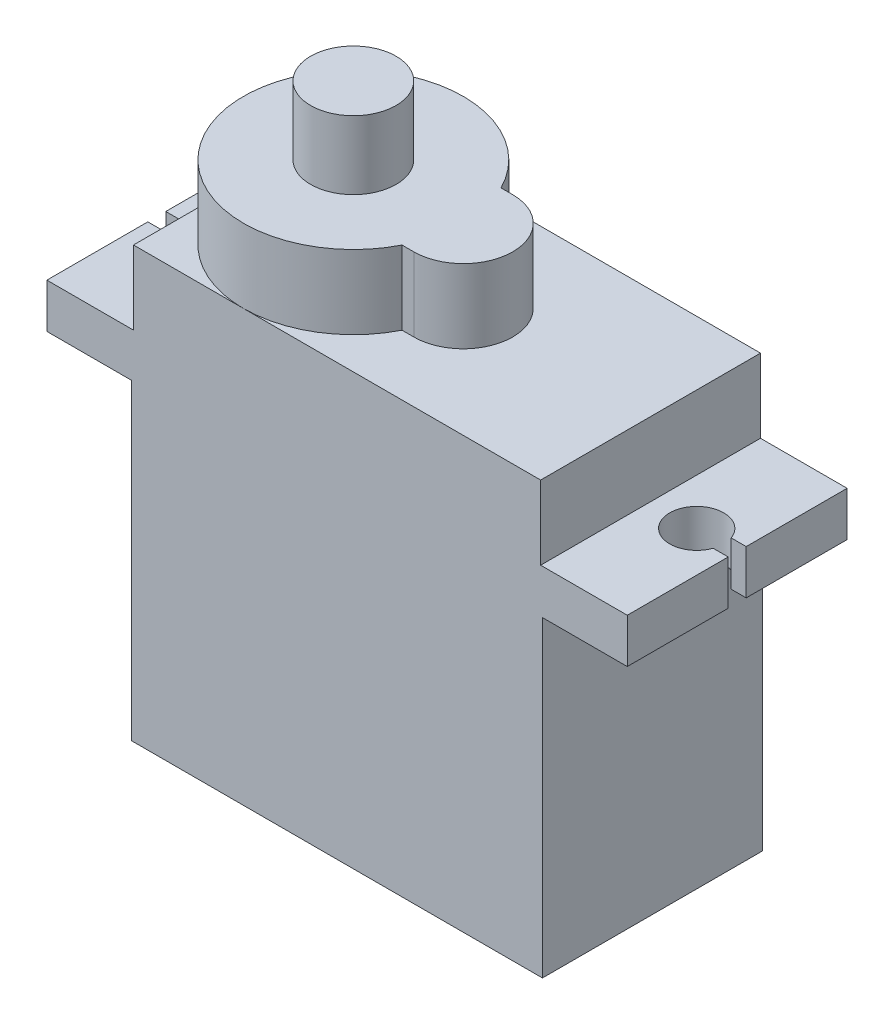
ISO-10303-21;
HEADER;
FILE_DESCRIPTION(('STEP AP214'),'2;1');
FILE_NAME('part.step','',(''),(''),'','','');
FILE_SCHEMA(('AUTOMOTIVE_DESIGN { 1 0 10303 214 1 1 1 1 }'));
ENDSEC;
DATA;
#1=APPLICATION_CONTEXT('core data for automotive mechanical design processes');
#2=APPLICATION_PROTOCOL_DEFINITION('international standard','automotive_design',2000,#1);
#3=PRODUCT_CONTEXT('',#1,'mechanical');
#4=PRODUCT('Part','Part','',(#3));
#5=PRODUCT_RELATED_PRODUCT_CATEGORY('part','',(#4));
#6=PRODUCT_DEFINITION_FORMATION('','',#4);
#7=PRODUCT_DEFINITION_CONTEXT('part definition',#1,'design');
#8=PRODUCT_DEFINITION('design','',#6,#7);
#9=PRODUCT_DEFINITION_SHAPE('','',#8);
#10=(LENGTH_UNIT() NAMED_UNIT(*) SI_UNIT(.MILLI.,.METRE.));
#11=(NAMED_UNIT(*) PLANE_ANGLE_UNIT() SI_UNIT($,.RADIAN.));
#12=(NAMED_UNIT(*) SI_UNIT($,.STERADIAN.) SOLID_ANGLE_UNIT());
#13=UNCERTAINTY_MEASURE_WITH_UNIT(LENGTH_MEASURE(1.E-05),#10,'distance_accuracy_value','');
#14=(GEOMETRIC_REPRESENTATION_CONTEXT(3) GLOBAL_UNCERTAINTY_ASSIGNED_CONTEXT((#13)) GLOBAL_UNIT_ASSIGNED_CONTEXT((#10,
#11,#12)) REPRESENTATION_CONTEXT('',''));
#15=CARTESIAN_POINT('',(0.,0.,0.));
#16=DIRECTION('',(0.,0.,1.));
#17=DIRECTION('',(1.,0.,0.));
#18=AXIS2_PLACEMENT_3D('',#15,#16,#17);
#19=CARTESIAN_POINT('',(0.,23.92,0.));
#20=DIRECTION('',(0.,1.,0.));
#21=DIRECTION('',(0.,0.,1.));
#22=AXIS2_PLACEMENT_3D('',#19,#20,#21);
#23=PLANE('',#22);
#24=CARTESIAN_POINT('',(6.21,23.92,-6.11));
#25=DIRECTION('',(0.,1.,0.));
#26=DIRECTION('',(0.,0.,1.));
#27=AXIS2_PLACEMENT_3D('',#24,#25,#26);
#28=CIRCLE('',#27,6.11);
#29=CARTESIAN_POINT('',(11.6661524905376,23.92,-8.86));
#30=VERTEX_POINT('',#29);
#31=CARTESIAN_POINT('',(6.21,23.92,-12.22));
#32=VERTEX_POINT('',#31);
#33=EDGE_CURVE('E60',#30,#32,#28,.T.);
#34=ORIENTED_EDGE('',*,*,#33,.F.);
#35=DIRECTION('',(-1.,0.,0.));
#36=VECTOR('',#35,1.);
#37=CARTESIAN_POINT('',(12.32,23.92,-8.86));
#38=LINE('',#37,#36);
#39=CARTESIAN_POINT('',(12.32,23.92,-8.86));
#40=VERTEX_POINT('',#39);
#41=EDGE_CURVE('E64',#40,#30,#38,.T.);
#42=ORIENTED_EDGE('',*,*,#41,.F.);
#43=CARTESIAN_POINT('',(12.32,23.92,-6.11));
#44=DIRECTION('',(0.,1.,0.));
#45=DIRECTION('',(0.,0.,1.));
#46=AXIS2_PLACEMENT_3D('',#43,#44,#45);
#47=CIRCLE('',#46,2.75);
#48=CARTESIAN_POINT('',(12.32,23.92,-3.36));
#49=VERTEX_POINT('',#48);
#50=EDGE_CURVE('E434',#49,#40,#47,.T.);
#51=ORIENTED_EDGE('',*,*,#50,.F.);
#52=DIRECTION('',(1.,0.,0.));
#53=VECTOR('',#52,1.);
#54=CARTESIAN_POINT('',(12.32,23.92,-3.36));
#55=LINE('',#54,#53);
#56=CARTESIAN_POINT('',(11.6661524905376,23.92,-3.36));
#57=VERTEX_POINT('',#56);
#58=EDGE_CURVE('E431',#57,#49,#55,.T.);
#59=ORIENTED_EDGE('',*,*,#58,.F.);
#60=CARTESIAN_POINT('',(6.21,23.92,0.));
#61=VERTEX_POINT('',#60);
#62=EDGE_CURVE('E249',#61,#57,#28,.T.);
#63=ORIENTED_EDGE('',*,*,#62,.F.);
#64=DIRECTION('',(1.,0.,0.));
#65=VECTOR('',#64,1.);
#66=CARTESIAN_POINT('',(0.100000000000003,23.92,0.));
#67=LINE('',#66,#65);
#68=CARTESIAN_POINT('',(22.73,23.92,0.));
#69=VERTEX_POINT('',#68);
#70=EDGE_CURVE('E262',#61,#69,#67,.T.);
#71=ORIENTED_EDGE('',*,*,#70,.T.);
#72=DIRECTION('',(0.,0.,-1.));
#73=VECTOR('',#72,1.);
#74=CARTESIAN_POINT('',(22.73,23.92,-12.22));
#75=LINE('',#74,#73);
#76=CARTESIAN_POINT('',(22.73,23.92,-12.22));
#77=VERTEX_POINT('',#76);
#78=EDGE_CURVE('E267',#69,#77,#75,.T.);
#79=ORIENTED_EDGE('',*,*,#78,.T.);
#80=DIRECTION('',(-1.,0.,0.));
#81=VECTOR('',#80,1.);
#82=CARTESIAN_POINT('',(0.100000000000001,23.92,-12.22));
#83=LINE('',#82,#81);
#84=EDGE_CURVE('E271',#77,#32,#83,.T.);
#85=ORIENTED_EDGE('',*,*,#84,.T.);
#86=EDGE_LOOP('',(#34,#42,#51,#59,#63,#71,#79,#85));
#87=FACE_BOUND('',#86,.T.);
#88=ADVANCED_FACE('F43',(#87),#23,.T.);
#89=CARTESIAN_POINT('',(0.100000000000002,23.92,-6.11));
#90=VERTEX_POINT('',#89);
#91=EDGE_CURVE('E52',#32,#90,#28,.T.);
#92=ORIENTED_EDGE('',*,*,#91,.F.);
#93=CARTESIAN_POINT('',(0.100000000000001,23.92,-12.22));
#94=VERTEX_POINT('',#93);
#95=EDGE_CURVE('E270',#32,#94,#83,.T.);
#96=ORIENTED_EDGE('',*,*,#95,.T.);
#97=DIRECTION('',(0.,0.,1.));
#98=VECTOR('',#97,1.);
#99=CARTESIAN_POINT('',(0.100000000000001,23.92,-12.22));
#100=LINE('',#99,#98);
#101=EDGE_CURVE('E259',#94,#90,#100,.T.);
#102=ORIENTED_EDGE('',*,*,#101,.T.);
#103=EDGE_LOOP('',(#92,#96,#102));
#104=FACE_BOUND('',#103,.T.);
#105=ADVANCED_FACE('F439',(#104),#23,.T.);
#106=CARTESIAN_POINT('',(-2.465,19.82,-6.11));
#107=DIRECTION('',(0.,1.,0.));
#108=DIRECTION('',(0.,0.,1.));
#109=AXIS2_PLACEMENT_3D('',#106,#107,#108);
#110=PLANE('',#109);
#111=DIRECTION('',(0.,0.,1.));
#112=VECTOR('',#111,1.);
#113=CARTESIAN_POINT('',(0.100000000000001,19.82,-12.22));
#114=LINE('',#113,#112);
#115=CARTESIAN_POINT('',(0.100000000000002,19.82,-12.22));
#116=VERTEX_POINT('',#115);
#117=CARTESIAN_POINT('',(0.100000000000002,19.82,0.));
#118=VERTEX_POINT('',#117);
#119=EDGE_CURVE('E250',#116,#118,#114,.T.);
#120=ORIENTED_EDGE('',*,*,#119,.F.);
#121=DIRECTION('',(-1.,0.,0.));
#122=VECTOR('',#121,1.);
#123=CARTESIAN_POINT('',(-4.715,19.82,-12.22));
#124=LINE('',#123,#122);
#125=CARTESIAN_POINT('',(-4.715,19.82,-12.22));
#126=VERTEX_POINT('',#125);
#127=EDGE_CURVE('E312',#116,#126,#124,.T.);
#128=ORIENTED_EDGE('',*,*,#127,.T.);
#129=DIRECTION('',(0.,0.,1.));
#130=VECTOR('',#129,1.);
#131=CARTESIAN_POINT('',(-4.715,19.82,-6.61));
#132=LINE('',#131,#130);
#133=CARTESIAN_POINT('',(-4.715,19.82,-6.61));
#134=VERTEX_POINT('',#133);
#135=EDGE_CURVE('E316',#126,#134,#132,.T.);
#136=ORIENTED_EDGE('',*,*,#135,.T.);
#137=DIRECTION('',(1.,0.,0.));
#138=VECTOR('',#137,1.);
#139=CARTESIAN_POINT('',(-4.715,19.82,-6.61));
#140=LINE('',#139,#138);
#141=CARTESIAN_POINT('',(-3.87921356237309,19.82,-6.61));
#142=VERTEX_POINT('',#141);
#143=EDGE_CURVE('E318',#134,#142,#140,.T.);
#144=ORIENTED_EDGE('',*,*,#143,.T.);
#145=CARTESIAN_POINT('',(-2.465,19.82,-6.11));
#146=DIRECTION('',(0.,-1.,0.));
#147=DIRECTION('',(0.,0.,1.));
#148=AXIS2_PLACEMENT_3D('',#145,#146,#147);
#149=CIRCLE('',#148,1.5);
#150=CARTESIAN_POINT('',(-3.87921356237309,19.82,-5.61));
#151=VERTEX_POINT('',#150);
#152=EDGE_CURVE('E320',#142,#151,#149,.T.);
#153=ORIENTED_EDGE('',*,*,#152,.T.);
#154=DIRECTION('',(-1.,0.,0.));
#155=VECTOR('',#154,1.);
#156=CARTESIAN_POINT('',(-4.715,19.82,-5.61));
#157=LINE('',#156,#155);
#158=CARTESIAN_POINT('',(-4.715,19.82,-5.61));
#159=VERTEX_POINT('',#158);
#160=EDGE_CURVE('E322',#151,#159,#157,.T.);
#161=ORIENTED_EDGE('',*,*,#160,.T.);
#162=DIRECTION('',(0.,0.,1.));
#163=VECTOR('',#162,1.);
#164=CARTESIAN_POINT('',(-4.715,19.82,0.));
#165=LINE('',#164,#163);
#166=CARTESIAN_POINT('',(-4.715,19.82,0.));
#167=VERTEX_POINT('',#166);
#168=EDGE_CURVE('E290',#159,#167,#165,.T.);
#169=ORIENTED_EDGE('',*,*,#168,.T.);
#170=DIRECTION('',(1.,0.,0.));
#171=VECTOR('',#170,1.);
#172=CARTESIAN_POINT('',(-4.715,19.82,0.));
#173=LINE('',#172,#171);
#174=EDGE_CURVE('E295',#167,#118,#173,.T.);
#175=ORIENTED_EDGE('',*,*,#174,.T.);
#176=EDGE_LOOP('',(#120,#128,#136,#144,#153,#161,#169,#175));
#177=FACE_BOUND('',#176,.T.);
#178=ADVANCED_FACE('F497',(#177),#110,.T.);
#179=CARTESIAN_POINT('',(0.,17.35,0.));
#180=DIRECTION('',(1.,0.,0.));
#181=DIRECTION('',(0.,0.,-1.));
#182=AXIS2_PLACEMENT_3D('',#179,#180,#181);
#183=PLANE('',#182);
#184=DIRECTION('',(0.,0.,1.));
#185=VECTOR('',#184,1.);
#186=CARTESIAN_POINT('',(0.,0.,0.));
#187=LINE('',#186,#185);
#188=CARTESIAN_POINT('',(0.,0.,-12.22));
#189=VERTEX_POINT('',#188);
#190=CARTESIAN_POINT('',(0.,0.,0.));
#191=VERTEX_POINT('',#190);
#192=EDGE_CURVE('E398',#189,#191,#187,.T.);
#193=ORIENTED_EDGE('',*,*,#192,.T.);
#194=DIRECTION('',(0.,-1.,0.));
#195=VECTOR('',#194,1.);
#196=CARTESIAN_POINT('',(0.,17.35,0.));
#197=LINE('',#196,#195);
#198=CARTESIAN_POINT('',(0.,17.35,0.));
#199=VERTEX_POINT('',#198);
#200=EDGE_CURVE('E47',#199,#191,#197,.T.);
#201=ORIENTED_EDGE('',*,*,#200,.F.);
#202=DIRECTION('',(0.,0.,1.));
#203=VECTOR('',#202,1.);
#204=CARTESIAN_POINT('',(0.,17.35,0.));
#205=LINE('',#204,#203);
#206=CARTESIAN_POINT('',(0.,17.35,-12.22));
#207=VERTEX_POINT('',#206);
#208=EDGE_CURVE('E399',#207,#199,#205,.T.);
#209=ORIENTED_EDGE('',*,*,#208,.F.);
#210=DIRECTION('',(0.,-1.,0.));
#211=VECTOR('',#210,1.);
#212=CARTESIAN_POINT('',(0.,17.35,-12.22));
#213=LINE('',#212,#211);
#214=EDGE_CURVE('E407',#207,#189,#213,.T.);
#215=ORIENTED_EDGE('',*,*,#214,.T.);
#216=EDGE_LOOP('',(#193,#201,#209,#215));
#217=FACE_BOUND('',#216,.T.);
#218=ADVANCED_FACE('F45',(#217),#183,.F.);
#219=CARTESIAN_POINT('',(0.,17.35,0.));
#220=DIRECTION('',(0.,0.,-1.));
#221=DIRECTION('',(-1.,0.,0.));
#222=AXIS2_PLACEMENT_3D('',#219,#220,#221);
#223=PLANE('',#222);
#224=DIRECTION('',(1.,0.,0.));
#225=VECTOR('',#224,1.);
#226=CARTESIAN_POINT('',(0.,0.,0.));
#227=LINE('',#226,#225);
#228=CARTESIAN_POINT('',(22.83,0.,0.));
#229=VERTEX_POINT('',#228);
#230=EDGE_CURVE('E410',#191,#229,#227,.T.);
#231=ORIENTED_EDGE('',*,*,#230,.T.);
#232=DIRECTION('',(0.,-1.,0.));
#233=VECTOR('',#232,1.);
#234=CARTESIAN_POINT('',(22.83,17.35,0.));
#235=LINE('',#234,#233);
#236=CARTESIAN_POINT('',(22.83,17.35,0.));
#237=VERTEX_POINT('',#236);
#238=EDGE_CURVE('E420',#237,#229,#235,.T.);
#239=ORIENTED_EDGE('',*,*,#238,.F.);
#240=DIRECTION('',(1.,0.,0.));
#241=VECTOR('',#240,1.);
#242=CARTESIAN_POINT('',(-4.715,17.35,0.));
#243=LINE('',#242,#241);
#244=CARTESIAN_POINT('',(27.545,17.35,0.));
#245=VERTEX_POINT('',#244);
#246=EDGE_CURVE('E327',#237,#245,#243,.T.);
#247=ORIENTED_EDGE('',*,*,#246,.T.);
#248=DIRECTION('',(0.,-1.,0.));
#249=VECTOR('',#248,1.);
#250=CARTESIAN_POINT('',(27.545,19.82,0.));
#251=LINE('',#250,#249);
#252=CARTESIAN_POINT('',(27.545,19.82,0.));
#253=VERTEX_POINT('',#252);
#254=EDGE_CURVE('E391',#253,#245,#251,.T.);
#255=ORIENTED_EDGE('',*,*,#254,.F.);
#256=CARTESIAN_POINT('',(22.73,19.82,0.));
#257=VERTEX_POINT('',#256);
#258=EDGE_CURVE('E293',#257,#253,#173,.T.);
#259=ORIENTED_EDGE('',*,*,#258,.F.);
#260=DIRECTION('',(0.,-1.,0.));
#261=VECTOR('',#260,1.);
#262=CARTESIAN_POINT('',(22.73,23.92,0.));
#263=LINE('',#262,#261);
#264=EDGE_CURVE('E283',#69,#257,#263,.T.);
#265=ORIENTED_EDGE('',*,*,#264,.F.);
#266=ORIENTED_EDGE('',*,*,#70,.F.);
#267=CARTESIAN_POINT('',(0.100000000000003,23.92,0.));
#268=VERTEX_POINT('',#267);
#269=EDGE_CURVE('E264',#268,#61,#67,.T.);
#270=ORIENTED_EDGE('',*,*,#269,.F.);
#271=DIRECTION('',(0.,-1.,0.));
#272=VECTOR('',#271,1.);
#273=CARTESIAN_POINT('',(0.100000000000003,23.92,0.));
#274=LINE('',#273,#272);
#275=EDGE_CURVE('E286',#268,#118,#274,.T.);
#276=ORIENTED_EDGE('',*,*,#275,.T.);
#277=ORIENTED_EDGE('',*,*,#174,.F.);
#278=DIRECTION('',(0.,-1.,0.));
#279=VECTOR('',#278,1.);
#280=CARTESIAN_POINT('',(-4.715,19.82,0.));
#281=LINE('',#280,#279);
#282=CARTESIAN_POINT('',(-4.715,17.35,0.));
#283=VERTEX_POINT('',#282);
#284=EDGE_CURVE('E395',#167,#283,#281,.T.);
#285=ORIENTED_EDGE('',*,*,#284,.T.);
#286=EDGE_CURVE('E328',#283,#199,#243,.T.);
#287=ORIENTED_EDGE('',*,*,#286,.T.);
#288=ORIENTED_EDGE('',*,*,#200,.T.);
#289=EDGE_LOOP('',(#231,#239,#247,#255,#259,#265,#266,#270,#276,#277,#285,#287,#288));
#290=FACE_BOUND('',#289,.T.);
#291=ADVANCED_FACE('F506',(#290),#223,.F.);
#292=CARTESIAN_POINT('',(22.83,17.35,0.));
#293=DIRECTION('',(-1.,0.,0.));
#294=DIRECTION('',(0.,0.,1.));
#295=AXIS2_PLACEMENT_3D('',#292,#293,#294);
#296=PLANE('',#295);
#297=DIRECTION('',(0.,0.,-1.));
#298=VECTOR('',#297,1.);
#299=CARTESIAN_POINT('',(22.83,0.,0.));
#300=LINE('',#299,#298);
#301=CARTESIAN_POINT('',(22.83,0.,-12.22));
#302=VERTEX_POINT('',#301);
#303=EDGE_CURVE('E412',#229,#302,#300,.T.);
#304=ORIENTED_EDGE('',*,*,#303,.T.);
#305=DIRECTION('',(0.,-1.,0.));
#306=VECTOR('',#305,1.);
#307=CARTESIAN_POINT('',(22.83,17.35,-12.22));
#308=LINE('',#307,#306);
#309=CARTESIAN_POINT('',(22.83,17.35,-12.22));
#310=VERTEX_POINT('',#309);
#311=EDGE_CURVE('E417',#310,#302,#308,.T.);
#312=ORIENTED_EDGE('',*,*,#311,.F.);
#313=DIRECTION('',(0.,0.,-1.));
#314=VECTOR('',#313,1.);
#315=CARTESIAN_POINT('',(22.83,17.35,0.));
#316=LINE('',#315,#314);
#317=EDGE_CURVE('E402',#237,#310,#316,.T.);
#318=ORIENTED_EDGE('',*,*,#317,.F.);
#319=ORIENTED_EDGE('',*,*,#238,.T.);
#320=EDGE_LOOP('',(#304,#312,#318,#319));
#321=FACE_BOUND('',#320,.T.);
#322=ADVANCED_FACE('F690',(#321),#296,.F.);
#323=CARTESIAN_POINT('',(0.,17.35,-12.22));
#324=DIRECTION('',(0.,0.,1.));
#325=DIRECTION('',(1.,0.,0.));
#326=AXIS2_PLACEMENT_3D('',#323,#324,#325);
#327=PLANE('',#326);
#328=DIRECTION('',(-1.,0.,0.));
#329=VECTOR('',#328,1.);
#330=CARTESIAN_POINT('',(0.,0.,-12.22));
#331=LINE('',#330,#329);
#332=EDGE_CURVE('E403',#302,#189,#331,.T.);
#333=ORIENTED_EDGE('',*,*,#332,.T.);
#334=ORIENTED_EDGE('',*,*,#214,.F.);
#335=DIRECTION('',(-1.,0.,0.));
#336=VECTOR('',#335,1.);
#337=CARTESIAN_POINT('',(-4.715,17.35,-12.22));
#338=LINE('',#337,#336);
#339=CARTESIAN_POINT('',(-4.715,17.35,-12.22));
#340=VERTEX_POINT('',#339);
#341=EDGE_CURVE('E345',#207,#340,#338,.T.);
#342=ORIENTED_EDGE('',*,*,#341,.T.);
#343=DIRECTION('',(0.,-1.,0.));
#344=VECTOR('',#343,1.);
#345=CARTESIAN_POINT('',(-4.715,19.82,-12.22));
#346=LINE('',#345,#344);
#347=EDGE_CURVE('E368',#126,#340,#346,.T.);
#348=ORIENTED_EDGE('',*,*,#347,.F.);
#349=ORIENTED_EDGE('',*,*,#127,.F.);
#350=DIRECTION('',(0.,-1.,0.));
#351=VECTOR('',#350,1.);
#352=CARTESIAN_POINT('',(0.100000000000001,23.92,-12.22));
#353=LINE('',#352,#351);
#354=EDGE_CURVE('E272',#94,#116,#353,.T.);
#355=ORIENTED_EDGE('',*,*,#354,.F.);
#356=ORIENTED_EDGE('',*,*,#95,.F.);
#357=ORIENTED_EDGE('',*,*,#84,.F.);
#358=DIRECTION('',(0.,-1.,0.));
#359=VECTOR('',#358,1.);
#360=CARTESIAN_POINT('',(22.73,23.92,-12.22));
#361=LINE('',#360,#359);
#362=CARTESIAN_POINT('',(22.73,19.82,-12.22));
#363=VERTEX_POINT('',#362);
#364=EDGE_CURVE('E279',#77,#363,#361,.T.);
#365=ORIENTED_EDGE('',*,*,#364,.T.);
#366=CARTESIAN_POINT('',(27.545,19.82,-12.22));
#367=VERTEX_POINT('',#366);
#368=EDGE_CURVE('E313',#367,#363,#124,.T.);
#369=ORIENTED_EDGE('',*,*,#368,.F.);
#370=DIRECTION('',(0.,-1.,0.));
#371=VECTOR('',#370,1.);
#372=CARTESIAN_POINT('',(27.545,19.82,-12.22));
#373=LINE('',#372,#371);
#374=CARTESIAN_POINT('',(27.545,17.35,-12.22));
#375=VERTEX_POINT('',#374);
#376=EDGE_CURVE('E371',#367,#375,#373,.T.);
#377=ORIENTED_EDGE('',*,*,#376,.T.);
#378=EDGE_CURVE('E346',#375,#310,#338,.T.);
#379=ORIENTED_EDGE('',*,*,#378,.T.);
#380=ORIENTED_EDGE('',*,*,#311,.T.);
#381=EDGE_LOOP('',(#333,#334,#342,#348,#349,#355,#356,#357,#365,#369,#377,#379,#380));
#382=FACE_BOUND('',#381,.T.);
#383=ADVANCED_FACE('F444',(#382),#327,.F.);
#384=CARTESIAN_POINT('',(0.,0.,0.));
#385=DIRECTION('',(0.,-1.,0.));
#386=DIRECTION('',(0.,0.,-1.));
#387=AXIS2_PLACEMENT_3D('',#384,#385,#386);
#388=PLANE('',#387);
#389=ORIENTED_EDGE('',*,*,#192,.F.);
#390=ORIENTED_EDGE('',*,*,#332,.F.);
#391=ORIENTED_EDGE('',*,*,#303,.F.);
#392=ORIENTED_EDGE('',*,*,#230,.F.);
#393=EDGE_LOOP('',(#389,#390,#391,#392));
#394=FACE_BOUND('',#393,.T.);
#395=ADVANCED_FACE('F472',(#394),#388,.T.);
#396=CARTESIAN_POINT('',(-2.465,17.35,-6.11));
#397=DIRECTION('',(0.,1.,0.));
#398=DIRECTION('',(0.,0.,1.));
#399=AXIS2_PLACEMENT_3D('',#396,#397,#398);
#400=PLANE('',#399);
#401=ORIENTED_EDGE('',*,*,#341,.F.);
#402=ORIENTED_EDGE('',*,*,#208,.T.);
#403=ORIENTED_EDGE('',*,*,#286,.F.);
#404=DIRECTION('',(0.,0.,1.));
#405=VECTOR('',#404,1.);
#406=CARTESIAN_POINT('',(-4.715,17.35,0.));
#407=LINE('',#406,#405);
#408=CARTESIAN_POINT('',(-4.715,17.35,-5.61));
#409=VERTEX_POINT('',#408);
#410=EDGE_CURVE('E289',#409,#283,#407,.T.);
#411=ORIENTED_EDGE('',*,*,#410,.F.);
#412=DIRECTION('',(-1.,0.,0.));
#413=VECTOR('',#412,1.);
#414=CARTESIAN_POINT('',(-4.715,17.35,-5.61));
#415=LINE('',#414,#413);
#416=CARTESIAN_POINT('',(-3.87921356237309,17.35,-5.61));
#417=VERTEX_POINT('',#416);
#418=EDGE_CURVE('E294',#417,#409,#415,.T.);
#419=ORIENTED_EDGE('',*,*,#418,.F.);
#420=CARTESIAN_POINT('',(-2.465,17.35,-6.11));
#421=DIRECTION('',(0.,-1.,0.));
#422=DIRECTION('',(0.,0.,1.));
#423=AXIS2_PLACEMENT_3D('',#420,#421,#422);
#424=CIRCLE('',#423,1.5);
#425=CARTESIAN_POINT('',(-3.87921356237309,17.35,-6.61));
#426=VERTEX_POINT('',#425);
#427=EDGE_CURVE('E354',#426,#417,#424,.T.);
#428=ORIENTED_EDGE('',*,*,#427,.F.);
#429=DIRECTION('',(1.,0.,0.));
#430=VECTOR('',#429,1.);
#431=CARTESIAN_POINT('',(-4.715,17.35,-6.61));
#432=LINE('',#431,#430);
#433=CARTESIAN_POINT('',(-4.715,17.35,-6.61));
#434=VERTEX_POINT('',#433);
#435=EDGE_CURVE('E352',#434,#426,#432,.T.);
#436=ORIENTED_EDGE('',*,*,#435,.F.);
#437=DIRECTION('',(0.,0.,1.));
#438=VECTOR('',#437,1.);
#439=CARTESIAN_POINT('',(-4.715,17.35,-6.61));
#440=LINE('',#439,#438);
#441=EDGE_CURVE('E350',#340,#434,#440,.T.);
#442=ORIENTED_EDGE('',*,*,#441,.F.);
#443=EDGE_LOOP('',(#401,#402,#403,#411,#419,#428,#436,#442));
#444=FACE_BOUND('',#443,.T.);
#445=ADVANCED_FACE('F484',(#444),#400,.F.);
#446=ORIENTED_EDGE('',*,*,#246,.F.);
#447=ORIENTED_EDGE('',*,*,#317,.T.);
#448=ORIENTED_EDGE('',*,*,#378,.F.);
#449=DIRECTION('',(0.,0.,-1.));
#450=VECTOR('',#449,1.);
#451=CARTESIAN_POINT('',(27.545,17.35,-6.61));
#452=LINE('',#451,#450);
#453=CARTESIAN_POINT('',(27.545,17.35,-6.61));
#454=VERTEX_POINT('',#453);
#455=EDGE_CURVE('E342',#454,#375,#452,.T.);
#456=ORIENTED_EDGE('',*,*,#455,.F.);
#457=DIRECTION('',(1.,0.,0.));
#458=VECTOR('',#457,1.);
#459=CARTESIAN_POINT('',(27.545,17.35,-6.61));
#460=LINE('',#459,#458);
#461=CARTESIAN_POINT('',(26.7092135623731,17.35,-6.61));
#462=VERTEX_POINT('',#461);
#463=EDGE_CURVE('E339',#462,#454,#460,.T.);
#464=ORIENTED_EDGE('',*,*,#463,.F.);
#465=CARTESIAN_POINT('',(25.295,17.35,-6.11));
#466=DIRECTION('',(0.,-1.,0.));
#467=DIRECTION('',(0.,0.,-1.));
#468=AXIS2_PLACEMENT_3D('',#465,#466,#467);
#469=CIRCLE('',#468,1.5);
#470=CARTESIAN_POINT('',(26.7092135623731,17.35,-5.61));
#471=VERTEX_POINT('',#470);
#472=EDGE_CURVE('E336',#471,#462,#469,.T.);
#473=ORIENTED_EDGE('',*,*,#472,.F.);
#474=DIRECTION('',(-1.,0.,0.));
#475=VECTOR('',#474,1.);
#476=CARTESIAN_POINT('',(27.545,17.35,-5.61));
#477=LINE('',#476,#475);
#478=CARTESIAN_POINT('',(27.545,17.35,-5.61));
#479=VERTEX_POINT('',#478);
#480=EDGE_CURVE('E333',#479,#471,#477,.T.);
#481=ORIENTED_EDGE('',*,*,#480,.F.);
#482=DIRECTION('',(0.,0.,-1.));
#483=VECTOR('',#482,1.);
#484=CARTESIAN_POINT('',(27.545,17.35,0.));
#485=LINE('',#484,#483);
#486=EDGE_CURVE('E331',#245,#479,#485,.T.);
#487=ORIENTED_EDGE('',*,*,#486,.F.);
#488=EDGE_LOOP('',(#446,#447,#448,#456,#464,#473,#481,#487));
#489=FACE_BOUND('',#488,.T.);
#490=ADVANCED_FACE('F467',(#489),#400,.F.);
#491=CARTESIAN_POINT('',(-4.715,19.82,0.));
#492=DIRECTION('',(1.,0.,0.));
#493=DIRECTION('',(0.,0.,-1.));
#494=AXIS2_PLACEMENT_3D('',#491,#492,#493);
#495=PLANE('',#494);
#496=ORIENTED_EDGE('',*,*,#410,.T.);
#497=ORIENTED_EDGE('',*,*,#284,.F.);
#498=ORIENTED_EDGE('',*,*,#168,.F.);
#499=DIRECTION('',(0.,-1.,0.));
#500=VECTOR('',#499,1.);
#501=CARTESIAN_POINT('',(-4.715,19.82,-5.61));
#502=LINE('',#501,#500);
#503=EDGE_CURVE('E324',#159,#409,#502,.T.);
#504=ORIENTED_EDGE('',*,*,#503,.T.);
#505=EDGE_LOOP('',(#496,#497,#498,#504));
#506=FACE_BOUND('',#505,.T.);
#507=ADVANCED_FACE('F722',(#506),#495,.F.);
#508=CARTESIAN_POINT('',(27.545,19.82,0.));
#509=DIRECTION('',(-1.,0.,0.));
#510=DIRECTION('',(0.,0.,1.));
#511=AXIS2_PLACEMENT_3D('',#508,#509,#510);
#512=PLANE('',#511);
#513=ORIENTED_EDGE('',*,*,#486,.T.);
#514=DIRECTION('',(0.,-1.,0.));
#515=VECTOR('',#514,1.);
#516=CARTESIAN_POINT('',(27.545,19.82,-5.61));
#517=LINE('',#516,#515);
#518=CARTESIAN_POINT('',(27.545,19.82,-5.61));
#519=VERTEX_POINT('',#518);
#520=EDGE_CURVE('E387',#519,#479,#517,.T.);
#521=ORIENTED_EDGE('',*,*,#520,.F.);
#522=DIRECTION('',(0.,0.,-1.));
#523=VECTOR('',#522,1.);
#524=CARTESIAN_POINT('',(27.545,19.82,0.));
#525=LINE('',#524,#523);
#526=EDGE_CURVE('E297',#253,#519,#525,.T.);
#527=ORIENTED_EDGE('',*,*,#526,.F.);
#528=ORIENTED_EDGE('',*,*,#254,.T.);
#529=EDGE_LOOP('',(#513,#521,#527,#528));
#530=FACE_BOUND('',#529,.T.);
#531=ADVANCED_FACE('F514',(#530),#512,.F.);
#532=CARTESIAN_POINT('',(27.545,19.82,-5.61));
#533=DIRECTION('',(0.,0.,1.));
#534=DIRECTION('',(1.,0.,0.));
#535=AXIS2_PLACEMENT_3D('',#532,#533,#534);
#536=PLANE('',#535);
#537=ORIENTED_EDGE('',*,*,#480,.T.);
#538=DIRECTION('',(0.,-1.,0.));
#539=VECTOR('',#538,1.);
#540=CARTESIAN_POINT('',(26.7092135623731,19.82,-5.61));
#541=LINE('',#540,#539);
#542=CARTESIAN_POINT('',(26.7092135623731,19.82,-5.61));
#543=VERTEX_POINT('',#542);
#544=EDGE_CURVE('E383',#543,#471,#541,.T.);
#545=ORIENTED_EDGE('',*,*,#544,.F.);
#546=DIRECTION('',(-1.,0.,0.));
#547=VECTOR('',#546,1.);
#548=CARTESIAN_POINT('',(27.545,19.82,-5.61));
#549=LINE('',#548,#547);
#550=EDGE_CURVE('E300',#519,#543,#549,.T.);
#551=ORIENTED_EDGE('',*,*,#550,.F.);
#552=ORIENTED_EDGE('',*,*,#520,.T.);
#553=EDGE_LOOP('',(#537,#545,#551,#552));
#554=FACE_BOUND('',#553,.T.);
#555=ADVANCED_FACE('F518',(#554),#536,.F.);
#556=CARTESIAN_POINT('',(25.295,19.82,-6.11));
#557=DIRECTION('',(0.,-1.,0.));
#558=DIRECTION('',(0.,0.,-1.));
#559=AXIS2_PLACEMENT_3D('',#556,#557,#558);
#560=CYLINDRICAL_SURFACE('',#559,1.5);
#561=ORIENTED_EDGE('',*,*,#472,.T.);
#562=DIRECTION('',(0.,-1.,0.));
#563=VECTOR('',#562,1.);
#564=CARTESIAN_POINT('',(26.7092135623731,19.82,-6.61));
#565=LINE('',#564,#563);
#566=CARTESIAN_POINT('',(26.7092135623731,19.82,-6.61));
#567=VERTEX_POINT('',#566);
#568=EDGE_CURVE('E379',#567,#462,#565,.T.);
#569=ORIENTED_EDGE('',*,*,#568,.F.);
#570=CARTESIAN_POINT('',(25.295,19.82,-6.11));
#571=DIRECTION('',(0.,-1.,0.));
#572=DIRECTION('',(0.,0.,-1.));
#573=AXIS2_PLACEMENT_3D('',#570,#571,#572);
#574=CIRCLE('',#573,1.5);
#575=EDGE_CURVE('E303',#543,#567,#574,.T.);
#576=ORIENTED_EDGE('',*,*,#575,.F.);
#577=ORIENTED_EDGE('',*,*,#544,.T.);
#578=EDGE_LOOP('',(#561,#569,#576,#577));
#579=FACE_BOUND('',#578,.T.);
#580=ADVANCED_FACE('F522',(#579),#560,.F.);
#581=CARTESIAN_POINT('',(27.545,19.82,-6.61));
#582=DIRECTION('',(0.,0.,-1.));
#583=DIRECTION('',(-1.,0.,0.));
#584=AXIS2_PLACEMENT_3D('',#581,#582,#583);
#585=PLANE('',#584);
#586=ORIENTED_EDGE('',*,*,#463,.T.);
#587=DIRECTION('',(0.,-1.,0.));
#588=VECTOR('',#587,1.);
#589=CARTESIAN_POINT('',(27.545,19.82,-6.61));
#590=LINE('',#589,#588);
#591=CARTESIAN_POINT('',(27.545,19.82,-6.61));
#592=VERTEX_POINT('',#591);
#593=EDGE_CURVE('E375',#592,#454,#590,.T.);
#594=ORIENTED_EDGE('',*,*,#593,.F.);
#595=DIRECTION('',(1.,0.,0.));
#596=VECTOR('',#595,1.);
#597=CARTESIAN_POINT('',(27.545,19.82,-6.61));
#598=LINE('',#597,#596);
#599=EDGE_CURVE('E306',#567,#592,#598,.T.);
#600=ORIENTED_EDGE('',*,*,#599,.F.);
#601=ORIENTED_EDGE('',*,*,#568,.T.);
#602=EDGE_LOOP('',(#586,#594,#600,#601));
#603=FACE_BOUND('',#602,.T.);
#604=ADVANCED_FACE('F524',(#603),#585,.F.);
#605=CARTESIAN_POINT('',(27.545,19.82,-6.61));
#606=DIRECTION('',(-1.,0.,0.));
#607=DIRECTION('',(0.,0.,1.));
#608=AXIS2_PLACEMENT_3D('',#605,#606,#607);
#609=PLANE('',#608);
#610=ORIENTED_EDGE('',*,*,#455,.T.);
#611=ORIENTED_EDGE('',*,*,#376,.F.);
#612=DIRECTION('',(0.,0.,-1.));
#613=VECTOR('',#612,1.);
#614=CARTESIAN_POINT('',(27.545,19.82,-6.61));
#615=LINE('',#614,#613);
#616=EDGE_CURVE('E309',#592,#367,#615,.T.);
#617=ORIENTED_EDGE('',*,*,#616,.F.);
#618=ORIENTED_EDGE('',*,*,#593,.T.);
#619=EDGE_LOOP('',(#610,#611,#617,#618));
#620=FACE_BOUND('',#619,.T.);
#621=ADVANCED_FACE('F462',(#620),#609,.F.);
#622=CARTESIAN_POINT('',(-4.715,19.82,-6.61));
#623=DIRECTION('',(1.,0.,0.));
#624=DIRECTION('',(0.,0.,-1.));
#625=AXIS2_PLACEMENT_3D('',#622,#623,#624);
#626=PLANE('',#625);
#627=ORIENTED_EDGE('',*,*,#441,.T.);
#628=DIRECTION('',(0.,-1.,0.));
#629=VECTOR('',#628,1.);
#630=CARTESIAN_POINT('',(-4.715,19.82,-6.61));
#631=LINE('',#630,#629);
#632=EDGE_CURVE('E365',#134,#434,#631,.T.);
#633=ORIENTED_EDGE('',*,*,#632,.F.);
#634=ORIENTED_EDGE('',*,*,#135,.F.);
#635=ORIENTED_EDGE('',*,*,#347,.T.);
#636=EDGE_LOOP('',(#627,#633,#634,#635));
#637=FACE_BOUND('',#636,.T.);
#638=ADVANCED_FACE('F481',(#637),#626,.F.);
#639=CARTESIAN_POINT('',(-4.715,19.82,-6.61));
#640=DIRECTION('',(0.,0.,-1.));
#641=DIRECTION('',(-1.,0.,0.));
#642=AXIS2_PLACEMENT_3D('',#639,#640,#641);
#643=PLANE('',#642);
#644=ORIENTED_EDGE('',*,*,#435,.T.);
#645=DIRECTION('',(0.,-1.,0.));
#646=VECTOR('',#645,1.);
#647=CARTESIAN_POINT('',(-3.87921356237309,19.82,-6.61));
#648=LINE('',#647,#646);
#649=EDGE_CURVE('E362',#142,#426,#648,.T.);
#650=ORIENTED_EDGE('',*,*,#649,.F.);
#651=ORIENTED_EDGE('',*,*,#143,.F.);
#652=ORIENTED_EDGE('',*,*,#632,.T.);
#653=EDGE_LOOP('',(#644,#650,#651,#652));
#654=FACE_BOUND('',#653,.T.);
#655=ADVANCED_FACE('F489',(#654),#643,.F.);
#656=CARTESIAN_POINT('',(-2.465,19.82,-6.11));
#657=DIRECTION('',(0.,-1.,0.));
#658=DIRECTION('',(0.,0.,-1.));
#659=AXIS2_PLACEMENT_3D('',#656,#657,#658);
#660=CYLINDRICAL_SURFACE('',#659,1.5);
#661=ORIENTED_EDGE('',*,*,#427,.T.);
#662=DIRECTION('',(0.,-1.,0.));
#663=VECTOR('',#662,1.);
#664=CARTESIAN_POINT('',(-3.87921356237309,19.82,-5.61));
#665=LINE('',#664,#663);
#666=EDGE_CURVE('E359',#151,#417,#665,.T.);
#667=ORIENTED_EDGE('',*,*,#666,.F.);
#668=ORIENTED_EDGE('',*,*,#152,.F.);
#669=ORIENTED_EDGE('',*,*,#649,.T.);
#670=EDGE_LOOP('',(#661,#667,#668,#669));
#671=FACE_BOUND('',#670,.T.);
#672=ADVANCED_FACE('F493',(#671),#660,.F.);
#673=CARTESIAN_POINT('',(-4.715,19.82,-5.61));
#674=DIRECTION('',(0.,0.,1.));
#675=DIRECTION('',(1.,0.,0.));
#676=AXIS2_PLACEMENT_3D('',#673,#674,#675);
#677=PLANE('',#676);
#678=ORIENTED_EDGE('',*,*,#418,.T.);
#679=ORIENTED_EDGE('',*,*,#503,.F.);
#680=ORIENTED_EDGE('',*,*,#160,.F.);
#681=ORIENTED_EDGE('',*,*,#666,.T.);
#682=EDGE_LOOP('',(#678,#679,#680,#681));
#683=FACE_BOUND('',#682,.T.);
#684=ADVANCED_FACE('F552',(#683),#677,.F.);
#685=DIRECTION('',(0.,0.,-1.));
#686=VECTOR('',#685,1.);
#687=CARTESIAN_POINT('',(22.73,19.82,-12.22));
#688=LINE('',#687,#686);
#689=EDGE_CURVE('E253',#257,#363,#688,.T.);
#690=ORIENTED_EDGE('',*,*,#689,.F.);
#691=ORIENTED_EDGE('',*,*,#258,.T.);
#692=ORIENTED_EDGE('',*,*,#526,.T.);
#693=ORIENTED_EDGE('',*,*,#550,.T.);
#694=ORIENTED_EDGE('',*,*,#575,.T.);
#695=ORIENTED_EDGE('',*,*,#599,.T.);
#696=ORIENTED_EDGE('',*,*,#616,.T.);
#697=ORIENTED_EDGE('',*,*,#368,.T.);
#698=EDGE_LOOP('',(#690,#691,#692,#693,#694,#695,#696,#697));
#699=FACE_BOUND('',#698,.T.);
#700=ADVANCED_FACE('F456',(#699),#110,.T.);
#701=CARTESIAN_POINT('',(0.100000000000001,23.92,-12.22));
#702=DIRECTION('',(1.,0.,0.));
#703=DIRECTION('',(0.,0.,-1.));
#704=AXIS2_PLACEMENT_3D('',#701,#702,#703);
#705=PLANE('',#704);
#706=ORIENTED_EDGE('',*,*,#119,.T.);
#707=ORIENTED_EDGE('',*,*,#275,.F.);
#708=EDGE_CURVE('E263',#90,#268,#100,.T.);
#709=ORIENTED_EDGE('',*,*,#708,.F.);
#710=ORIENTED_EDGE('',*,*,#101,.F.);
#711=ORIENTED_EDGE('',*,*,#354,.T.);
#712=EDGE_LOOP('',(#706,#707,#709,#710,#711));
#713=FACE_BOUND('',#712,.T.);
#714=ADVANCED_FACE('F500',(#713),#705,.F.);
#715=CARTESIAN_POINT('',(22.73,23.92,-12.22));
#716=DIRECTION('',(-1.,0.,0.));
#717=DIRECTION('',(0.,0.,1.));
#718=AXIS2_PLACEMENT_3D('',#715,#716,#717);
#719=PLANE('',#718);
#720=ORIENTED_EDGE('',*,*,#689,.T.);
#721=ORIENTED_EDGE('',*,*,#364,.F.);
#722=ORIENTED_EDGE('',*,*,#78,.F.);
#723=ORIENTED_EDGE('',*,*,#264,.T.);
#724=EDGE_LOOP('',(#720,#721,#722,#723));
#725=FACE_BOUND('',#724,.T.);
#726=ADVANCED_FACE('F451',(#725),#719,.F.);
#727=EDGE_CURVE('E427',#90,#61,#28,.T.);
#728=ORIENTED_EDGE('',*,*,#727,.F.);
#729=ORIENTED_EDGE('',*,*,#708,.T.);
#730=ORIENTED_EDGE('',*,*,#269,.T.);
#731=EDGE_LOOP('',(#728,#729,#730));
#732=FACE_BOUND('',#731,.T.);
#733=ADVANCED_FACE('F505',(#732),#23,.T.);
#734=CARTESIAN_POINT('',(6.21,28.02,-6.11));
#735=DIRECTION('',(0.,-1.,0.));
#736=DIRECTION('',(0.,0.,-1.));
#737=AXIS2_PLACEMENT_3D('',#734,#735,#736);
#738=CYLINDRICAL_SURFACE('',#737,6.11);
#739=ORIENTED_EDGE('',*,*,#33,.T.);
#740=ORIENTED_EDGE('',*,*,#91,.T.);
#741=ORIENTED_EDGE('',*,*,#727,.T.);
#742=ORIENTED_EDGE('',*,*,#62,.T.);
#743=DIRECTION('',(0.,-1.,0.));
#744=VECTOR('',#743,1.);
#745=CARTESIAN_POINT('',(11.6661524905376,28.02,-3.36));
#746=LINE('',#745,#744);
#747=CARTESIAN_POINT('',(11.6661524905376,28.02,-3.36));
#748=VERTEX_POINT('',#747);
#749=EDGE_CURVE('E230',#748,#57,#746,.T.);
#750=ORIENTED_EDGE('',*,*,#749,.F.);
#751=CARTESIAN_POINT('',(6.21,28.02,-6.11));
#752=DIRECTION('',(0.,1.,0.));
#753=DIRECTION('',(0.,0.,1.));
#754=AXIS2_PLACEMENT_3D('',#751,#752,#753);
#755=CIRCLE('',#754,6.11);
#756=CARTESIAN_POINT('',(11.6661524905376,28.02,-8.86));
#757=VERTEX_POINT('',#756);
#758=EDGE_CURVE('E236',#757,#748,#755,.T.);
#759=ORIENTED_EDGE('',*,*,#758,.F.);
#760=DIRECTION('',(0.,-1.,0.));
#761=VECTOR('',#760,1.);
#762=CARTESIAN_POINT('',(11.6661524905376,28.02,-8.86));
#763=LINE('',#762,#761);
#764=EDGE_CURVE('E671',#757,#30,#763,.T.);
#765=ORIENTED_EDGE('',*,*,#764,.T.);
#766=EDGE_LOOP('',(#739,#740,#741,#742,#750,#759,#765));
#767=FACE_BOUND('',#766,.T.);
#768=ADVANCED_FACE('F247',(#767),#738,.T.);
#769=CARTESIAN_POINT('',(12.32,28.02,-3.36));
#770=DIRECTION('',(0.,0.,-1.));
#771=DIRECTION('',(-1.,0.,0.));
#772=AXIS2_PLACEMENT_3D('',#769,#770,#771);
#773=PLANE('',#772);
#774=ORIENTED_EDGE('',*,*,#58,.T.);
#775=DIRECTION('',(0.,-1.,0.));
#776=VECTOR('',#775,1.);
#777=CARTESIAN_POINT('',(12.32,28.02,-3.36));
#778=LINE('',#777,#776);
#779=CARTESIAN_POINT('',(12.32,28.02,-3.36));
#780=VERTEX_POINT('',#779);
#781=EDGE_CURVE('E232',#780,#49,#778,.T.);
#782=ORIENTED_EDGE('',*,*,#781,.F.);
#783=DIRECTION('',(1.,0.,0.));
#784=VECTOR('',#783,1.);
#785=CARTESIAN_POINT('',(12.32,28.02,-3.36));
#786=LINE('',#785,#784);
#787=EDGE_CURVE('E225',#748,#780,#786,.T.);
#788=ORIENTED_EDGE('',*,*,#787,.F.);
#789=ORIENTED_EDGE('',*,*,#749,.T.);
#790=EDGE_LOOP('',(#774,#782,#788,#789));
#791=FACE_BOUND('',#790,.T.);
#792=ADVANCED_FACE('F228',(#791),#773,.F.);
#793=CARTESIAN_POINT('',(12.32,28.02,-6.11));
#794=DIRECTION('',(0.,-1.,0.));
#795=DIRECTION('',(0.,0.,-1.));
#796=AXIS2_PLACEMENT_3D('',#793,#794,#795);
#797=CYLINDRICAL_SURFACE('',#796,2.75);
#798=ORIENTED_EDGE('',*,*,#50,.T.);
#799=DIRECTION('',(0.,-1.,0.));
#800=VECTOR('',#799,1.);
#801=CARTESIAN_POINT('',(12.32,28.02,-8.86));
#802=LINE('',#801,#800);
#803=CARTESIAN_POINT('',(12.32,28.02,-8.86));
#804=VERTEX_POINT('',#803);
#805=EDGE_CURVE('E255',#804,#40,#802,.T.);
#806=ORIENTED_EDGE('',*,*,#805,.F.);
#807=CARTESIAN_POINT('',(12.32,28.02,-6.11));
#808=DIRECTION('',(0.,1.,0.));
#809=DIRECTION('',(0.,0.,1.));
#810=AXIS2_PLACEMENT_3D('',#807,#808,#809);
#811=CIRCLE('',#810,2.75);
#812=EDGE_CURVE('E235',#780,#804,#811,.T.);
#813=ORIENTED_EDGE('',*,*,#812,.F.);
#814=ORIENTED_EDGE('',*,*,#781,.T.);
#815=EDGE_LOOP('',(#798,#806,#813,#814));
#816=FACE_BOUND('',#815,.T.);
#817=ADVANCED_FACE('F615',(#816),#797,.T.);
#818=CARTESIAN_POINT('',(12.32,28.02,-8.86));
#819=DIRECTION('',(0.,0.,1.));
#820=DIRECTION('',(1.,0.,0.));
#821=AXIS2_PLACEMENT_3D('',#818,#819,#820);
#822=PLANE('',#821);
#823=ORIENTED_EDGE('',*,*,#41,.T.);
#824=ORIENTED_EDGE('',*,*,#764,.F.);
#825=DIRECTION('',(-1.,0.,0.));
#826=VECTOR('',#825,1.);
#827=CARTESIAN_POINT('',(12.32,28.02,-8.86));
#828=LINE('',#827,#826);
#829=EDGE_CURVE('E241',#804,#757,#828,.T.);
#830=ORIENTED_EDGE('',*,*,#829,.F.);
#831=ORIENTED_EDGE('',*,*,#805,.T.);
#832=EDGE_LOOP('',(#823,#824,#830,#831));
#833=FACE_BOUND('',#832,.T.);
#834=ADVANCED_FACE('F624',(#833),#822,.F.);
#835=CARTESIAN_POINT('',(6.21,28.02,-6.11));
#836=DIRECTION('',(0.,1.,0.));
#837=DIRECTION('',(0.,0.,1.));
#838=AXIS2_PLACEMENT_3D('',#835,#836,#837);
#839=PLANE('',#838);
#840=CARTESIAN_POINT('',(6.21,28.02,-6.11));
#841=DIRECTION('',(0.,1.,0.));
#842=DIRECTION('',(0.,0.,1.));
#843=AXIS2_PLACEMENT_3D('',#840,#841,#842);
#844=CIRCLE('',#843,2.375);
#845=CARTESIAN_POINT('',(6.21,28.02,-8.485));
#846=VERTEX_POINT('',#845);
#847=EDGE_CURVE('E11',#846,#846,#844,.T.);
#848=ORIENTED_EDGE('',*,*,#847,.F.);
#849=EDGE_LOOP('',(#848));
#850=FACE_BOUND('',#849,.T.);
#851=ORIENTED_EDGE('',*,*,#758,.T.);
#852=ORIENTED_EDGE('',*,*,#787,.T.);
#853=ORIENTED_EDGE('',*,*,#812,.T.);
#854=ORIENTED_EDGE('',*,*,#829,.T.);
#855=EDGE_LOOP('',(#851,#852,#853,#854));
#856=FACE_BOUND('',#855,.T.);
#857=ADVANCED_FACE('F239',(#850,#856),#839,.T.);
#858=CARTESIAN_POINT('',(6.21,31.82,-6.11));
#859=DIRECTION('',(0.,-1.,0.));
#860=DIRECTION('',(0.,0.,-1.));
#861=AXIS2_PLACEMENT_3D('',#858,#859,#860);
#862=CYLINDRICAL_SURFACE('',#861,2.375);
#863=CARTESIAN_POINT('',(6.21,31.82,-6.11));
#864=DIRECTION('',(0.,1.,0.));
#865=DIRECTION('',(0.,0.,1.));
#866=AXIS2_PLACEMENT_3D('',#863,#864,#865);
#867=CIRCLE('',#866,2.375);
#868=CARTESIAN_POINT('',(6.21,31.82,-8.485));
#869=VERTEX_POINT('',#868);
#870=EDGE_CURVE('E432',#869,#869,#867,.T.);
#871=CARTESIAN_POINT('',(6.21,31.82,-8.485));
#872=CARTESIAN_POINT('',(6.21,31.7804166666667,-8.485));
#873=CARTESIAN_POINT('',(6.21,31.7408333333333,-8.485));
#874=CARTESIAN_POINT('',(6.21,31.6616666666667,-8.485));
#875=CARTESIAN_POINT('',(6.21,31.6220833333333,-8.485));
#876=CARTESIAN_POINT('',(6.21,31.5429166666667,-8.485));
#877=CARTESIAN_POINT('',(6.21,31.5033333333333,-8.485));
#878=CARTESIAN_POINT('',(6.21,31.4241666666667,-8.485));
#879=CARTESIAN_POINT('',(6.21,31.3845833333333,-8.485));
#880=CARTESIAN_POINT('',(6.21,31.3054166666667,-8.485));
#881=CARTESIAN_POINT('',(6.21,31.2658333333333,-8.485));
#882=CARTESIAN_POINT('',(6.21,31.1866666666667,-8.485));
#883=CARTESIAN_POINT('',(6.21,31.1470833333333,-8.485));
#884=CARTESIAN_POINT('',(6.21,31.0679166666667,-8.485));
#885=CARTESIAN_POINT('',(6.21,31.0283333333333,-8.485));
#886=CARTESIAN_POINT('',(6.21,30.9491666666667,-8.485));
#887=CARTESIAN_POINT('',(6.21,30.9095833333333,-8.485));
#888=CARTESIAN_POINT('',(6.21,30.8304166666667,-8.485));
#889=CARTESIAN_POINT('',(6.21,30.7908333333333,-8.485));
#890=CARTESIAN_POINT('',(6.21,30.7116666666667,-8.485));
#891=CARTESIAN_POINT('',(6.21,30.6720833333333,-8.485));
#892=CARTESIAN_POINT('',(6.21,30.5929166666667,-8.485));
#893=CARTESIAN_POINT('',(6.21,30.5533333333333,-8.485));
#894=CARTESIAN_POINT('',(6.21,30.4741666666667,-8.485));
#895=CARTESIAN_POINT('',(6.21,30.4345833333333,-8.485));
#896=CARTESIAN_POINT('',(6.21,30.3554166666667,-8.485));
#897=CARTESIAN_POINT('',(6.21,30.3158333333333,-8.485));
#898=CARTESIAN_POINT('',(6.21,30.2366666666667,-8.485));
#899=CARTESIAN_POINT('',(6.21,30.1970833333333,-8.485));
#900=CARTESIAN_POINT('',(6.21,30.1179166666667,-8.485));
#901=CARTESIAN_POINT('',(6.21,30.0783333333333,-8.485));
#902=CARTESIAN_POINT('',(6.21,29.9991666666667,-8.485));
#903=CARTESIAN_POINT('',(6.21,29.9595833333333,-8.485));
#904=CARTESIAN_POINT('',(6.21,29.8804166666667,-8.485));
#905=CARTESIAN_POINT('',(6.21,29.8408333333333,-8.485));
#906=CARTESIAN_POINT('',(6.21,29.7616666666667,-8.485));
#907=CARTESIAN_POINT('',(6.21,29.7220833333333,-8.485));
#908=CARTESIAN_POINT('',(6.21,29.6429166666667,-8.485));
#909=CARTESIAN_POINT('',(6.21,29.6033333333333,-8.485));
#910=CARTESIAN_POINT('',(6.21,29.5241666666667,-8.485));
#911=CARTESIAN_POINT('',(6.21,29.4845833333333,-8.485));
#912=CARTESIAN_POINT('',(6.21,29.4054166666667,-8.485));
#913=CARTESIAN_POINT('',(6.21,29.3658333333333,-8.485));
#914=CARTESIAN_POINT('',(6.21,29.2866666666667,-8.485));
#915=CARTESIAN_POINT('',(6.21,29.2470833333333,-8.485));
#916=CARTESIAN_POINT('',(6.21,29.1679166666667,-8.485));
#917=CARTESIAN_POINT('',(6.21,29.1283333333333,-8.485));
#918=CARTESIAN_POINT('',(6.21,29.0491666666667,-8.485));
#919=CARTESIAN_POINT('',(6.21,29.0095833333333,-8.485));
#920=CARTESIAN_POINT('',(6.21,28.9304166666667,-8.485));
#921=CARTESIAN_POINT('',(6.21,28.8908333333333,-8.485));
#922=CARTESIAN_POINT('',(6.21,28.8116666666667,-8.485));
#923=CARTESIAN_POINT('',(6.21,28.7720833333333,-8.485));
#924=CARTESIAN_POINT('',(6.21,28.6929166666667,-8.485));
#925=CARTESIAN_POINT('',(6.21,28.6533333333333,-8.485));
#926=CARTESIAN_POINT('',(6.21,28.5741666666667,-8.485));
#927=CARTESIAN_POINT('',(6.21,28.5345833333333,-8.485));
#928=CARTESIAN_POINT('',(6.21,28.4554166666667,-8.485));
#929=CARTESIAN_POINT('',(6.21,28.4158333333333,-8.485));
#930=CARTESIAN_POINT('',(6.21,28.3366666666667,-8.485));
#931=CARTESIAN_POINT('',(6.21,28.2970833333333,-8.485));
#932=CARTESIAN_POINT('',(6.21,28.2179166666667,-8.485));
#933=CARTESIAN_POINT('',(6.21,28.1783333333333,-8.485));
#934=CARTESIAN_POINT('',(6.21,28.0991666666667,-8.485));
#935=CARTESIAN_POINT('',(6.21,28.0595833333333,-8.485));
#936=CARTESIAN_POINT('',(6.21,28.02,-8.485));
#937=B_SPLINE_CURVE_WITH_KNOTS('',3,(#871,#872,#873,#874,#875,#876,#877,#878,#879,#880,#881,
#882,#883,#884,#885,#886,#887,#888,#889,#890,#891,#892,#893,#894,#895,#896,#897,#898,#899,#900,
#901,#902,#903,#904,#905,#906,#907,#908,#909,#910,#911,#912,#913,#914,#915,#916,#917,#918,#919,
#920,#921,#922,#923,#924,#925,#926,#927,#928,#929,#930,#931,#932,#933,#934,#935,#936),
.UNSPECIFIED.,.F.,.F.,(4,2,2,2,2,2,2,2,2,2,2,2,2,2,2,2,2,2,2,2,2,2,2,2,2,2,2,2,2,2,2,2,4),(0.,
0.118750000000001,0.237500000000002,0.356250000000002,0.475000000000003,0.593750000000004,
0.712500000000005,0.831250000000002,0.950000000000003,1.06875,1.1875,1.30625,1.425,1.54375,
1.6625,1.78125,1.9,2.01875,2.1375,2.25625,2.375,2.49375,2.6125,2.73125,2.85,2.96875,3.0875,
3.20625,3.325,3.44375,3.5625,3.68125,3.8),.UNSPECIFIED.);
#938=EDGE_CURVE('BSEAM643',#869,#846,#937,.T.);
#939=ORIENTED_EDGE('',*,*,#870,.F.);
#940=ORIENTED_EDGE('',*,*,#847,.T.);
#941=ORIENTED_EDGE('',*,*,#938,.T.);
#942=ORIENTED_EDGE('',*,*,#938,.F.);
#943=EDGE_LOOP('',(#939,#941,#940,#942));
#944=FACE_BOUND('',#943,.T.);
#945=ADVANCED_FACE('F643',(#944),#862,.T.);
#946=CARTESIAN_POINT('',(6.21,31.82,-6.11));
#947=DIRECTION('',(0.,1.,0.));
#948=DIRECTION('',(0.,0.,1.));
#949=AXIS2_PLACEMENT_3D('',#946,#947,#948);
#950=PLANE('',#949);
#951=ORIENTED_EDGE('',*,*,#870,.T.);
#952=EDGE_LOOP('',(#951));
#953=FACE_BOUND('',#952,.T.);
#954=ADVANCED_FACE('F653',(#953),#950,.T.);
#955=CLOSED_SHELL('',(#88,#105,#178,#218,#291,#322,#383,#395,#445,#490,#507,#531,#555,#580,#604,
#621,#638,#655,#672,#684,#700,#714,#726,#733,#768,#792,#817,#834,#857,#945,#954));
#956=MANIFOLD_SOLID_BREP('B2',#955);
#957=ADVANCED_BREP_SHAPE_REPRESENTATION('',(#18,#956),#14);
#958=SHAPE_DEFINITION_REPRESENTATION(#9,#957);
ENDSEC;
END-ISO-10303-21;
